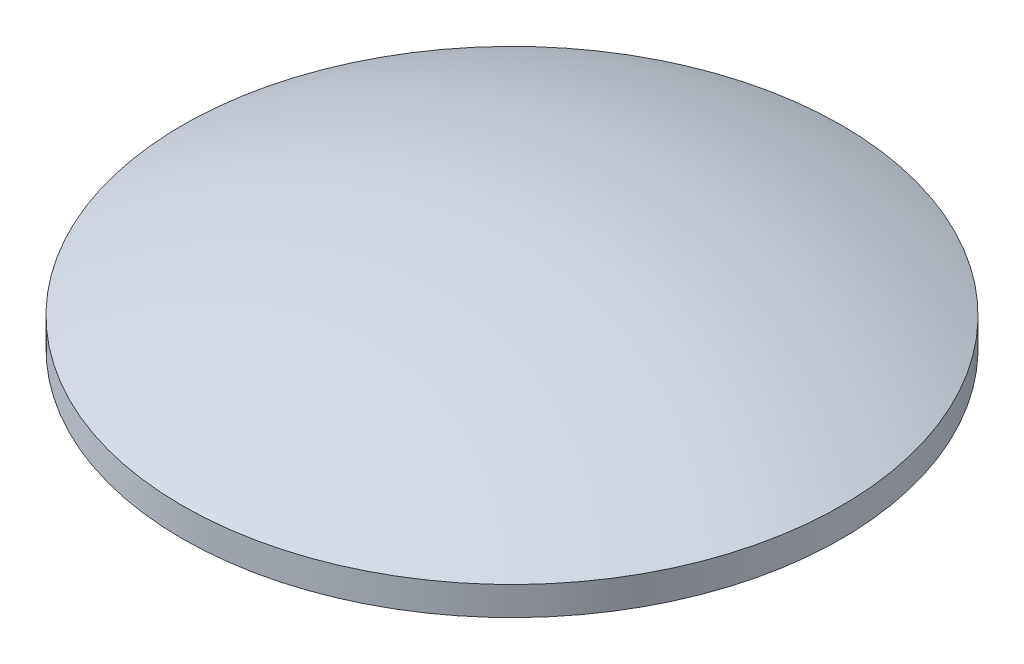
ISO-10303-21;
HEADER;
FILE_DESCRIPTION(('STEP AP214'),'2;1');
FILE_NAME('part.step','',(''),(''),'','','');
FILE_SCHEMA(('AUTOMOTIVE_DESIGN { 1 0 10303 214 1 1 1 1 }'));
ENDSEC;
DATA;
#1=APPLICATION_CONTEXT('core data for automotive mechanical design processes');
#2=APPLICATION_PROTOCOL_DEFINITION('international standard','automotive_design',2000,#1);
#3=PRODUCT_CONTEXT('',#1,'mechanical');
#4=PRODUCT('Part','Part','',(#3));
#5=PRODUCT_RELATED_PRODUCT_CATEGORY('part','',(#4));
#6=PRODUCT_DEFINITION_FORMATION('','',#4);
#7=PRODUCT_DEFINITION_CONTEXT('part definition',#1,'design');
#8=PRODUCT_DEFINITION('design','',#6,#7);
#9=PRODUCT_DEFINITION_SHAPE('','',#8);
#10=(LENGTH_UNIT() NAMED_UNIT(*) SI_UNIT(.MILLI.,.METRE.));
#11=(NAMED_UNIT(*) PLANE_ANGLE_UNIT() SI_UNIT($,.RADIAN.));
#12=(NAMED_UNIT(*) SI_UNIT($,.STERADIAN.) SOLID_ANGLE_UNIT());
#13=UNCERTAINTY_MEASURE_WITH_UNIT(LENGTH_MEASURE(1.E-05),#10,'distance_accuracy_value','');
#14=(GEOMETRIC_REPRESENTATION_CONTEXT(3) GLOBAL_UNCERTAINTY_ASSIGNED_CONTEXT((#13)) GLOBAL_UNIT_ASSIGNED_CONTEXT((#10,
#11,#12)) REPRESENTATION_CONTEXT('',''));
#15=CARTESIAN_POINT('',(0.,0.,0.));
#16=DIRECTION('',(0.,0.,1.));
#17=DIRECTION('',(1.,0.,0.));
#18=AXIS2_PLACEMENT_3D('',#15,#16,#17);
#19=CARTESIAN_POINT('',(0.,0.254,0.));
#20=DIRECTION('',(0.,-1.,0.));
#21=DIRECTION('',(0.,0.,-1.));
#22=AXIS2_PLACEMENT_3D('',#19,#20,#21);
#23=CYLINDRICAL_SURFACE('',#22,2.921);
#24=CARTESIAN_POINT('',(0.,0.254,0.));
#25=DIRECTION('',(0.,1.,0.));
#26=DIRECTION('',(0.,0.,1.));
#27=AXIS2_PLACEMENT_3D('',#24,#25,#26);
#28=CIRCLE('',#27,2.921);
#29=CARTESIAN_POINT('',(0.,0.254,2.921));
#30=VERTEX_POINT('',#29);
#31=EDGE_CURVE('E10',#30,#30,#28,.T.);
#32=ORIENTED_EDGE('',*,*,#31,.F.);
#33=EDGE_LOOP('',(#32));
#34=FACE_BOUND('',#33,.T.);
#35=CARTESIAN_POINT('',(0.,0.,0.));
#36=DIRECTION('',(0.,1.,0.));
#37=DIRECTION('',(0.,0.,1.));
#38=AXIS2_PLACEMENT_3D('',#35,#36,#37);
#39=CIRCLE('',#38,2.921);
#40=CARTESIAN_POINT('',(0.,0.,2.921));
#41=VERTEX_POINT('',#40);
#42=EDGE_CURVE('E42',#41,#41,#39,.T.);
#43=ORIENTED_EDGE('',*,*,#42,.T.);
#44=EDGE_LOOP('',(#43));
#45=FACE_BOUND('',#44,.T.);
#46=ADVANCED_FACE('F35',(#34,#45),#23,.T.);
#47=CARTESIAN_POINT('',(0.,-6.1468,0.));
#48=DIRECTION('',(0.,0.,1.));
#49=DIRECTION('',(1.,0.,0.));
#50=AXIS2_PLACEMENT_3D('',#47,#48,#49);
#51=SPHERICAL_SURFACE('',#50,7.0358);
#52=CARTESIAN_POINT('',(0.,-6.1468,0.));
#53=DIRECTION('',(0.,1.,0.));
#54=DIRECTION('',(0.,0.,1.));
#55=AXIS2_PLACEMENT_3D('',#52,#53,#54);
#56=SPHERICAL_SURFACE('',#55,7.0358);
#57=ORIENTED_EDGE('',*,*,#31,.T.);
#58=EDGE_LOOP('',(#57));
#59=FACE_BOUND('',#58,.T.);
#60=ADVANCED_FACE('F37',(#59),#56,.T.);
#61=CARTESIAN_POINT('',(0.,0.,0.));
#62=DIRECTION('',(0.,1.,0.));
#63=DIRECTION('',(0.,0.,1.));
#64=AXIS2_PLACEMENT_3D('',#61,#62,#63);
#65=PLANE('',#64);
#66=ORIENTED_EDGE('',*,*,#42,.F.);
#67=EDGE_LOOP('',(#66));
#68=FACE_BOUND('',#67,.T.);
#69=ADVANCED_FACE('F49',(#68),#65,.F.);
#70=CLOSED_SHELL('',(#46,#60,#69));
#71=MANIFOLD_SOLID_BREP('B2',#70);
#72=ADVANCED_BREP_SHAPE_REPRESENTATION('',(#18,#71),#14);
#73=SHAPE_DEFINITION_REPRESENTATION(#9,#72);
ENDSEC;
END-ISO-10303-21;
